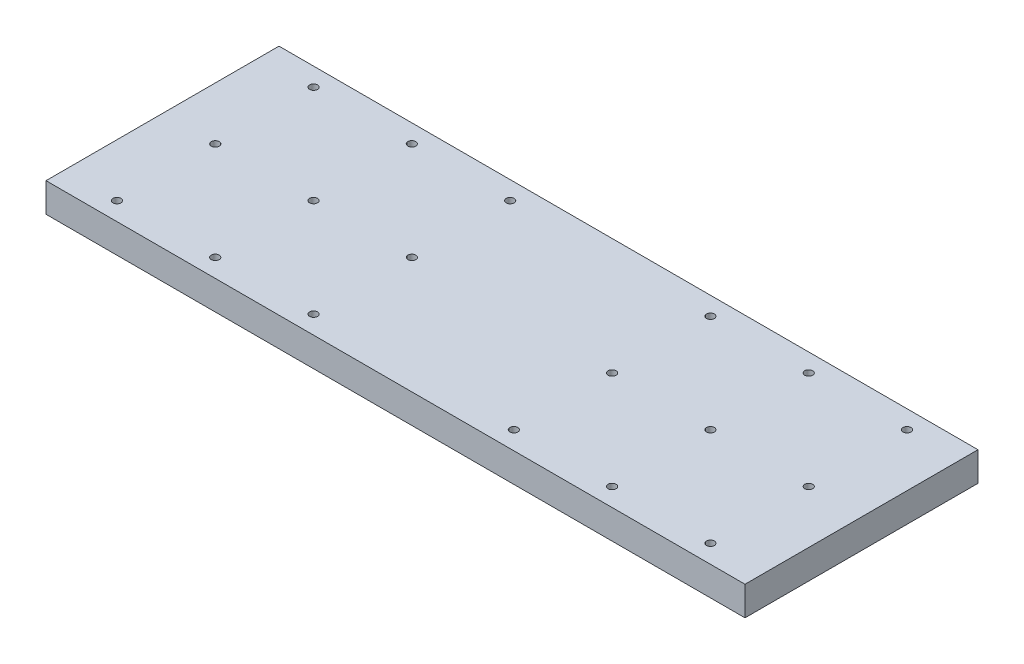
ISO-10303-21;
HEADER;
FILE_DESCRIPTION(('STEP AP214'),'2;1');
FILE_NAME('part.step','',(''),(''),'','','');
FILE_SCHEMA(('AUTOMOTIVE_DESIGN { 1 0 10303 214 1 1 1 1 }'));
ENDSEC;
DATA;
#1=APPLICATION_CONTEXT('core data for automotive mechanical design processes');
#2=APPLICATION_PROTOCOL_DEFINITION('international standard','automotive_design',2000,#1);
#3=PRODUCT_CONTEXT('',#1,'mechanical');
#4=PRODUCT('Part','Part','',(#3));
#5=PRODUCT_RELATED_PRODUCT_CATEGORY('part','',(#4));
#6=PRODUCT_DEFINITION_FORMATION('','',#4);
#7=PRODUCT_DEFINITION_CONTEXT('part definition',#1,'design');
#8=PRODUCT_DEFINITION('design','',#6,#7);
#9=PRODUCT_DEFINITION_SHAPE('','',#8);
#10=(LENGTH_UNIT() NAMED_UNIT(*) SI_UNIT(.MILLI.,.METRE.));
#11=(NAMED_UNIT(*) PLANE_ANGLE_UNIT() SI_UNIT($,.RADIAN.));
#12=(NAMED_UNIT(*) SI_UNIT($,.STERADIAN.) SOLID_ANGLE_UNIT());
#13=UNCERTAINTY_MEASURE_WITH_UNIT(LENGTH_MEASURE(1.E-05),#10,'distance_accuracy_value','');
#14=(GEOMETRIC_REPRESENTATION_CONTEXT(3) GLOBAL_UNCERTAINTY_ASSIGNED_CONTEXT((#13)) GLOBAL_UNIT_ASSIGNED_CONTEXT((#10,
#11,#12)) REPRESENTATION_CONTEXT('',''));
#15=CARTESIAN_POINT('',(0.,0.,0.));
#16=DIRECTION('',(0.,0.,1.));
#17=DIRECTION('',(1.,0.,0.));
#18=AXIS2_PLACEMENT_3D('',#15,#16,#17);
#19=CARTESIAN_POINT('',(0.,12.7,0.));
#20=DIRECTION('',(1.,0.,0.));
#21=DIRECTION('',(0.,0.,-1.));
#22=AXIS2_PLACEMENT_3D('',#19,#20,#21);
#23=PLANE('',#22);
#24=DIRECTION('',(0.,0.,1.));
#25=VECTOR('',#24,1.);
#26=CARTESIAN_POINT('',(0.,0.,0.));
#27=LINE('',#26,#25);
#28=CARTESIAN_POINT('',(0.,0.,-101.6));
#29=VERTEX_POINT('',#28);
#30=CARTESIAN_POINT('',(0.,0.,0.));
#31=VERTEX_POINT('',#30);
#32=EDGE_CURVE('E98',#29,#31,#27,.T.);
#33=ORIENTED_EDGE('',*,*,#32,.T.);
#34=DIRECTION('',(0.,-1.,0.));
#35=VECTOR('',#34,1.);
#36=CARTESIAN_POINT('',(0.,12.7,0.));
#37=LINE('',#36,#35);
#38=CARTESIAN_POINT('',(0.,12.7,0.));
#39=VERTEX_POINT('',#38);
#40=EDGE_CURVE('E11',#39,#31,#37,.T.);
#41=ORIENTED_EDGE('',*,*,#40,.F.);
#42=DIRECTION('',(0.,0.,1.));
#43=VECTOR('',#42,1.);
#44=CARTESIAN_POINT('',(0.,12.7,0.));
#45=LINE('',#44,#43);
#46=CARTESIAN_POINT('',(0.,12.7,-101.6));
#47=VERTEX_POINT('',#46);
#48=EDGE_CURVE('E86',#47,#39,#45,.T.);
#49=ORIENTED_EDGE('',*,*,#48,.F.);
#50=DIRECTION('',(0.,-1.,0.));
#51=VECTOR('',#50,1.);
#52=CARTESIAN_POINT('',(0.,12.7,-101.6));
#53=LINE('',#52,#51);
#54=EDGE_CURVE('E94',#47,#29,#53,.T.);
#55=ORIENTED_EDGE('',*,*,#54,.T.);
#56=EDGE_LOOP('',(#33,#41,#49,#55));
#57=FACE_BOUND('',#56,.T.);
#58=ADVANCED_FACE('F35',(#57),#23,.F.);
#59=CARTESIAN_POINT('',(0.,12.7,0.));
#60=DIRECTION('',(0.,0.,-1.));
#61=DIRECTION('',(-1.,0.,0.));
#62=AXIS2_PLACEMENT_3D('',#59,#60,#61);
#63=PLANE('',#62);
#64=DIRECTION('',(1.,0.,0.));
#65=VECTOR('',#64,1.);
#66=CARTESIAN_POINT('',(0.,0.,0.));
#67=LINE('',#66,#65);
#68=CARTESIAN_POINT('',(304.8,0.,0.));
#69=VERTEX_POINT('',#68);
#70=EDGE_CURVE('E90',#31,#69,#67,.T.);
#71=ORIENTED_EDGE('',*,*,#70,.T.);
#72=DIRECTION('',(0.,-1.,0.));
#73=VECTOR('',#72,1.);
#74=CARTESIAN_POINT('',(304.8,12.7,0.));
#75=LINE('',#74,#73);
#76=CARTESIAN_POINT('',(304.8,12.7,0.));
#77=VERTEX_POINT('',#76);
#78=EDGE_CURVE('E43',#77,#69,#75,.T.);
#79=ORIENTED_EDGE('',*,*,#78,.F.);
#80=DIRECTION('',(1.,0.,0.));
#81=VECTOR('',#80,1.);
#82=CARTESIAN_POINT('',(0.,12.7,0.));
#83=LINE('',#82,#81);
#84=EDGE_CURVE('E81',#39,#77,#83,.T.);
#85=ORIENTED_EDGE('',*,*,#84,.F.);
#86=ORIENTED_EDGE('',*,*,#40,.T.);
#87=EDGE_LOOP('',(#71,#79,#85,#86));
#88=FACE_BOUND('',#87,.T.);
#89=ADVANCED_FACE('F89',(#88),#63,.F.);
#90=CARTESIAN_POINT('',(304.8,12.7,0.));
#91=DIRECTION('',(-1.,0.,0.));
#92=DIRECTION('',(0.,0.,1.));
#93=AXIS2_PLACEMENT_3D('',#90,#91,#92);
#94=PLANE('',#93);
#95=DIRECTION('',(0.,0.,-1.));
#96=VECTOR('',#95,1.);
#97=CARTESIAN_POINT('',(304.8,0.,0.));
#98=LINE('',#97,#96);
#99=CARTESIAN_POINT('',(304.8,0.,-101.6));
#100=VERTEX_POINT('',#99);
#101=EDGE_CURVE('E68',#69,#100,#98,.T.);
#102=ORIENTED_EDGE('',*,*,#101,.T.);
#103=DIRECTION('',(0.,-1.,0.));
#104=VECTOR('',#103,1.);
#105=CARTESIAN_POINT('',(304.8,12.7,-101.6));
#106=LINE('',#105,#104);
#107=CARTESIAN_POINT('',(304.8,12.7,-101.6));
#108=VERTEX_POINT('',#107);
#109=EDGE_CURVE('E91',#108,#100,#106,.T.);
#110=ORIENTED_EDGE('',*,*,#109,.F.);
#111=DIRECTION('',(0.,0.,-1.));
#112=VECTOR('',#111,1.);
#113=CARTESIAN_POINT('',(304.8,12.7,0.));
#114=LINE('',#113,#112);
#115=EDGE_CURVE('E84',#77,#108,#114,.T.);
#116=ORIENTED_EDGE('',*,*,#115,.F.);
#117=ORIENTED_EDGE('',*,*,#78,.T.);
#118=EDGE_LOOP('',(#102,#110,#116,#117));
#119=FACE_BOUND('',#118,.T.);
#120=ADVANCED_FACE('F92',(#119),#94,.F.);
#121=CARTESIAN_POINT('',(0.,12.7,-101.6));
#122=DIRECTION('',(0.,0.,1.));
#123=DIRECTION('',(1.,0.,0.));
#124=AXIS2_PLACEMENT_3D('',#121,#122,#123);
#125=PLANE('',#124);
#126=DIRECTION('',(-1.,0.,0.));
#127=VECTOR('',#126,1.);
#128=CARTESIAN_POINT('',(0.,0.,-101.6));
#129=LINE('',#128,#127);
#130=EDGE_CURVE('E74',#100,#29,#129,.T.);
#131=ORIENTED_EDGE('',*,*,#130,.T.);
#132=ORIENTED_EDGE('',*,*,#54,.F.);
#133=DIRECTION('',(-1.,0.,0.));
#134=VECTOR('',#133,1.);
#135=CARTESIAN_POINT('',(0.,12.7,-101.6));
#136=LINE('',#135,#134);
#137=EDGE_CURVE('E51',#108,#47,#136,.T.);
#138=ORIENTED_EDGE('',*,*,#137,.F.);
#139=ORIENTED_EDGE('',*,*,#109,.T.);
#140=EDGE_LOOP('',(#131,#132,#138,#139));
#141=FACE_BOUND('',#140,.T.);
#142=ADVANCED_FACE('F106',(#141),#125,.F.);
#143=CARTESIAN_POINT('',(0.,12.7,0.));
#144=DIRECTION('',(0.,-1.,0.));
#145=DIRECTION('',(0.,0.,-1.));
#146=AXIS2_PLACEMENT_3D('',#143,#144,#145);
#147=PLANE('',#146);
#148=CARTESIAN_POINT('',(23.01875,12.7,-93.6625));
#149=DIRECTION('',(0.,1.,0.));
#150=DIRECTION('',(0.,0.,1.));
#151=AXIS2_PLACEMENT_3D('',#148,#149,#150);
#152=CIRCLE('',#151,1.72719999999999);
#153=CARTESIAN_POINT('',(23.01875,12.7,-91.9353));
#154=VERTEX_POINT('',#153);
#155=EDGE_CURVE('E216',#154,#154,#152,.T.);
#156=ORIENTED_EDGE('',*,*,#155,.F.);
#157=EDGE_LOOP('',(#156));
#158=FACE_BOUND('',#157,.T.);
#159=CARTESIAN_POINT('',(65.8571604822856,12.7,-93.6625));
#160=DIRECTION('',(0.,1.,0.));
#161=DIRECTION('',(0.,0.,1.));
#162=AXIS2_PLACEMENT_3D('',#159,#160,#161);
#163=CIRCLE('',#162,1.72719999999998);
#164=CARTESIAN_POINT('',(65.8571604822856,12.7,-91.9353));
#165=VERTEX_POINT('',#164);
#166=EDGE_CURVE('E210',#165,#165,#163,.T.);
#167=ORIENTED_EDGE('',*,*,#166,.F.);
#168=EDGE_LOOP('',(#167));
#169=FACE_BOUND('',#168,.T.);
#170=CARTESIAN_POINT('',(108.74375,12.7,-93.6625));
#171=DIRECTION('',(0.,1.,0.));
#172=DIRECTION('',(0.,0.,1.));
#173=AXIS2_PLACEMENT_3D('',#170,#171,#172);
#174=CIRCLE('',#173,1.72719999999998);
#175=CARTESIAN_POINT('',(108.74375,12.7,-91.9353));
#176=VERTEX_POINT('',#175);
#177=EDGE_CURVE('E204',#176,#176,#174,.T.);
#178=ORIENTED_EDGE('',*,*,#177,.F.);
#179=EDGE_LOOP('',(#178));
#180=FACE_BOUND('',#179,.T.);
#181=CARTESIAN_POINT('',(196.05625,12.7,-93.6625));
#182=DIRECTION('',(0.,1.,0.));
#183=DIRECTION('',(0.,0.,1.));
#184=AXIS2_PLACEMENT_3D('',#181,#182,#183);
#185=CIRCLE('',#184,1.72719999999998);
#186=CARTESIAN_POINT('',(196.05625,12.7,-91.9353));
#187=VERTEX_POINT('',#186);
#188=EDGE_CURVE('E198',#187,#187,#185,.T.);
#189=ORIENTED_EDGE('',*,*,#188,.F.);
#190=EDGE_LOOP('',(#189));
#191=FACE_BOUND('',#190,.T.);
#192=CARTESIAN_POINT('',(238.91875,12.7,-93.6625));
#193=DIRECTION('',(0.,1.,0.));
#194=DIRECTION('',(0.,0.,1.));
#195=AXIS2_PLACEMENT_3D('',#192,#193,#194);
#196=CIRCLE('',#195,1.72719999999998);
#197=CARTESIAN_POINT('',(238.91875,12.7,-91.9353));
#198=VERTEX_POINT('',#197);
#199=EDGE_CURVE('E192',#198,#198,#196,.T.);
#200=ORIENTED_EDGE('',*,*,#199,.F.);
#201=EDGE_LOOP('',(#200));
#202=FACE_BOUND('',#201,.T.);
#203=CARTESIAN_POINT('',(281.78125,12.7,-93.6625));
#204=DIRECTION('',(0.,1.,0.));
#205=DIRECTION('',(0.,0.,1.));
#206=AXIS2_PLACEMENT_3D('',#203,#204,#205);
#207=CIRCLE('',#206,1.72719999999998);
#208=CARTESIAN_POINT('',(281.78125,12.7,-91.9353));
#209=VERTEX_POINT('',#208);
#210=EDGE_CURVE('E186',#209,#209,#207,.T.);
#211=ORIENTED_EDGE('',*,*,#210,.F.);
#212=EDGE_LOOP('',(#211));
#213=FACE_BOUND('',#212,.T.);
#214=CARTESIAN_POINT('',(23.01875,12.7,-50.8));
#215=DIRECTION('',(0.,1.,0.));
#216=DIRECTION('',(0.,0.,1.));
#217=AXIS2_PLACEMENT_3D('',#214,#215,#216);
#218=CIRCLE('',#217,1.72719999999999);
#219=CARTESIAN_POINT('',(23.01875,12.7,-49.0728));
#220=VERTEX_POINT('',#219);
#221=EDGE_CURVE('E180',#220,#220,#218,.T.);
#222=ORIENTED_EDGE('',*,*,#221,.F.);
#223=EDGE_LOOP('',(#222));
#224=FACE_BOUND('',#223,.T.);
#225=CARTESIAN_POINT('',(65.8571604822857,12.7,-50.8));
#226=DIRECTION('',(0.,1.,0.));
#227=DIRECTION('',(0.,0.,1.));
#228=AXIS2_PLACEMENT_3D('',#225,#226,#227);
#229=CIRCLE('',#228,1.72719999999998);
#230=CARTESIAN_POINT('',(65.8571604822857,12.7,-49.0728));
#231=VERTEX_POINT('',#230);
#232=EDGE_CURVE('E174',#231,#231,#229,.T.);
#233=ORIENTED_EDGE('',*,*,#232,.F.);
#234=EDGE_LOOP('',(#233));
#235=FACE_BOUND('',#234,.T.);
#236=CARTESIAN_POINT('',(108.74375,12.7,-50.8));
#237=DIRECTION('',(0.,1.,0.));
#238=DIRECTION('',(0.,0.,1.));
#239=AXIS2_PLACEMENT_3D('',#236,#237,#238);
#240=CIRCLE('',#239,1.72719999999998);
#241=CARTESIAN_POINT('',(108.74375,12.7,-49.0728));
#242=VERTEX_POINT('',#241);
#243=EDGE_CURVE('E168',#242,#242,#240,.T.);
#244=ORIENTED_EDGE('',*,*,#243,.F.);
#245=EDGE_LOOP('',(#244));
#246=FACE_BOUND('',#245,.T.);
#247=CARTESIAN_POINT('',(196.05625,12.7,-50.8));
#248=DIRECTION('',(0.,1.,0.));
#249=DIRECTION('',(0.,0.,1.));
#250=AXIS2_PLACEMENT_3D('',#247,#248,#249);
#251=CIRCLE('',#250,1.72719999999998);
#252=CARTESIAN_POINT('',(196.05625,12.7,-49.0728));
#253=VERTEX_POINT('',#252);
#254=EDGE_CURVE('E162',#253,#253,#251,.T.);
#255=ORIENTED_EDGE('',*,*,#254,.F.);
#256=EDGE_LOOP('',(#255));
#257=FACE_BOUND('',#256,.T.);
#258=CARTESIAN_POINT('',(238.91875,12.7,-50.8));
#259=DIRECTION('',(0.,1.,0.));
#260=DIRECTION('',(0.,0.,1.));
#261=AXIS2_PLACEMENT_3D('',#258,#259,#260);
#262=CIRCLE('',#261,1.72719999999998);
#263=CARTESIAN_POINT('',(238.91875,12.7,-49.0728));
#264=VERTEX_POINT('',#263);
#265=EDGE_CURVE('E156',#264,#264,#262,.T.);
#266=ORIENTED_EDGE('',*,*,#265,.F.);
#267=EDGE_LOOP('',(#266));
#268=FACE_BOUND('',#267,.T.);
#269=CARTESIAN_POINT('',(281.78125,12.7,-50.8));
#270=DIRECTION('',(0.,1.,0.));
#271=DIRECTION('',(0.,0.,1.));
#272=AXIS2_PLACEMENT_3D('',#269,#270,#271);
#273=CIRCLE('',#272,1.72719999999998);
#274=CARTESIAN_POINT('',(281.78125,12.7,-49.0728));
#275=VERTEX_POINT('',#274);
#276=EDGE_CURVE('E150',#275,#275,#273,.T.);
#277=ORIENTED_EDGE('',*,*,#276,.F.);
#278=EDGE_LOOP('',(#277));
#279=FACE_BOUND('',#278,.T.);
#280=CARTESIAN_POINT('',(23.01875,12.7,-7.9375));
#281=DIRECTION('',(0.,1.,0.));
#282=DIRECTION('',(0.,0.,1.));
#283=AXIS2_PLACEMENT_3D('',#280,#281,#282);
#284=CIRCLE('',#283,1.72719999999999);
#285=CARTESIAN_POINT('',(23.01875,12.7,-6.21030000000001));
#286=VERTEX_POINT('',#285);
#287=EDGE_CURVE('E144',#286,#286,#284,.T.);
#288=ORIENTED_EDGE('',*,*,#287,.F.);
#289=EDGE_LOOP('',(#288));
#290=FACE_BOUND('',#289,.T.);
#291=CARTESIAN_POINT('',(65.8571604822857,12.7,-7.9375));
#292=DIRECTION('',(0.,1.,0.));
#293=DIRECTION('',(0.,0.,1.));
#294=AXIS2_PLACEMENT_3D('',#291,#292,#293);
#295=CIRCLE('',#294,1.72719999999998);
#296=CARTESIAN_POINT('',(65.8571604822857,12.7,-6.21030000000002));
#297=VERTEX_POINT('',#296);
#298=EDGE_CURVE('E138',#297,#297,#295,.T.);
#299=ORIENTED_EDGE('',*,*,#298,.F.);
#300=EDGE_LOOP('',(#299));
#301=FACE_BOUND('',#300,.T.);
#302=CARTESIAN_POINT('',(108.74375,12.7,-7.9375));
#303=DIRECTION('',(0.,1.,0.));
#304=DIRECTION('',(0.,0.,1.));
#305=AXIS2_PLACEMENT_3D('',#302,#303,#304);
#306=CIRCLE('',#305,1.72719999999998);
#307=CARTESIAN_POINT('',(108.74375,12.7,-6.21030000000002));
#308=VERTEX_POINT('',#307);
#309=EDGE_CURVE('E132',#308,#308,#306,.T.);
#310=ORIENTED_EDGE('',*,*,#309,.F.);
#311=EDGE_LOOP('',(#310));
#312=FACE_BOUND('',#311,.T.);
#313=CARTESIAN_POINT('',(196.05625,12.7,-7.9375));
#314=DIRECTION('',(0.,1.,0.));
#315=DIRECTION('',(0.,0.,1.));
#316=AXIS2_PLACEMENT_3D('',#313,#314,#315);
#317=CIRCLE('',#316,1.72719999999998);
#318=CARTESIAN_POINT('',(196.05625,12.7,-6.21030000000002));
#319=VERTEX_POINT('',#318);
#320=EDGE_CURVE('E126',#319,#319,#317,.T.);
#321=ORIENTED_EDGE('',*,*,#320,.F.);
#322=EDGE_LOOP('',(#321));
#323=FACE_BOUND('',#322,.T.);
#324=CARTESIAN_POINT('',(238.91875,12.7,-7.9375));
#325=DIRECTION('',(0.,1.,0.));
#326=DIRECTION('',(0.,0.,1.));
#327=AXIS2_PLACEMENT_3D('',#324,#325,#326);
#328=CIRCLE('',#327,1.72719999999998);
#329=CARTESIAN_POINT('',(238.91875,12.7,-6.21030000000002));
#330=VERTEX_POINT('',#329);
#331=EDGE_CURVE('E120',#330,#330,#328,.T.);
#332=ORIENTED_EDGE('',*,*,#331,.F.);
#333=EDGE_LOOP('',(#332));
#334=FACE_BOUND('',#333,.T.);
#335=CARTESIAN_POINT('',(281.78125,12.7,-7.9375));
#336=DIRECTION('',(0.,1.,0.));
#337=DIRECTION('',(0.,0.,1.));
#338=AXIS2_PLACEMENT_3D('',#335,#336,#337);
#339=CIRCLE('',#338,1.72719999999998);
#340=CARTESIAN_POINT('',(281.78125,12.7,-6.21030000000002));
#341=VERTEX_POINT('',#340);
#342=EDGE_CURVE('E114',#341,#341,#339,.T.);
#343=ORIENTED_EDGE('',*,*,#342,.F.);
#344=EDGE_LOOP('',(#343));
#345=FACE_BOUND('',#344,.T.);
#346=ORIENTED_EDGE('',*,*,#48,.T.);
#347=ORIENTED_EDGE('',*,*,#84,.T.);
#348=ORIENTED_EDGE('',*,*,#115,.T.);
#349=ORIENTED_EDGE('',*,*,#137,.T.);
#350=EDGE_LOOP('',(#346,#347,#348,#349));
#351=FACE_BOUND('',#350,.T.);
#352=ADVANCED_FACE('F82',(#158,#169,#180,#191,#202,#213,#224,#235,#246,#257,#268,#279,#290,#301,
#312,#323,#334,#345,#351),#147,.F.);
#353=CARTESIAN_POINT('',(0.,0.,0.));
#354=DIRECTION('',(0.,-1.,0.));
#355=DIRECTION('',(0.,0.,-1.));
#356=AXIS2_PLACEMENT_3D('',#353,#354,#355);
#357=PLANE('',#356);
#358=CARTESIAN_POINT('',(23.01875,0.,-93.6625));
#359=DIRECTION('',(0.,1.,0.));
#360=DIRECTION('',(0.,0.,1.));
#361=AXIS2_PLACEMENT_3D('',#358,#359,#360);
#362=CIRCLE('',#361,1.7272);
#363=CARTESIAN_POINT('',(23.01875,0.,-91.9353));
#364=VERTEX_POINT('',#363);
#365=EDGE_CURVE('E213',#364,#364,#362,.T.);
#366=ORIENTED_EDGE('',*,*,#365,.T.);
#367=EDGE_LOOP('',(#366));
#368=FACE_BOUND('',#367,.T.);
#369=CARTESIAN_POINT('',(65.8571604822856,0.,-93.6625));
#370=DIRECTION('',(0.,1.,0.));
#371=DIRECTION('',(0.,0.,1.));
#372=AXIS2_PLACEMENT_3D('',#369,#370,#371);
#373=CIRCLE('',#372,1.7272);
#374=CARTESIAN_POINT('',(65.8571604822856,0.,-91.9353));
#375=VERTEX_POINT('',#374);
#376=EDGE_CURVE('E207',#375,#375,#373,.T.);
#377=ORIENTED_EDGE('',*,*,#376,.T.);
#378=EDGE_LOOP('',(#377));
#379=FACE_BOUND('',#378,.T.);
#380=CARTESIAN_POINT('',(108.74375,0.,-93.6625));
#381=DIRECTION('',(0.,1.,0.));
#382=DIRECTION('',(0.,0.,1.));
#383=AXIS2_PLACEMENT_3D('',#380,#381,#382);
#384=CIRCLE('',#383,1.7272);
#385=CARTESIAN_POINT('',(108.74375,0.,-91.9353));
#386=VERTEX_POINT('',#385);
#387=EDGE_CURVE('E201',#386,#386,#384,.T.);
#388=ORIENTED_EDGE('',*,*,#387,.T.);
#389=EDGE_LOOP('',(#388));
#390=FACE_BOUND('',#389,.T.);
#391=CARTESIAN_POINT('',(196.05625,0.,-93.6625));
#392=DIRECTION('',(0.,1.,0.));
#393=DIRECTION('',(0.,0.,1.));
#394=AXIS2_PLACEMENT_3D('',#391,#392,#393);
#395=CIRCLE('',#394,1.72719999999998);
#396=CARTESIAN_POINT('',(196.05625,0.,-91.9353));
#397=VERTEX_POINT('',#396);
#398=EDGE_CURVE('E195',#397,#397,#395,.T.);
#399=ORIENTED_EDGE('',*,*,#398,.T.);
#400=EDGE_LOOP('',(#399));
#401=FACE_BOUND('',#400,.T.);
#402=CARTESIAN_POINT('',(238.91875,0.,-93.6625));
#403=DIRECTION('',(0.,1.,0.));
#404=DIRECTION('',(0.,0.,1.));
#405=AXIS2_PLACEMENT_3D('',#402,#403,#404);
#406=CIRCLE('',#405,1.72719999999998);
#407=CARTESIAN_POINT('',(238.91875,0.,-91.9353));
#408=VERTEX_POINT('',#407);
#409=EDGE_CURVE('E189',#408,#408,#406,.T.);
#410=ORIENTED_EDGE('',*,*,#409,.T.);
#411=EDGE_LOOP('',(#410));
#412=FACE_BOUND('',#411,.T.);
#413=CARTESIAN_POINT('',(281.78125,0.,-93.6625));
#414=DIRECTION('',(0.,1.,0.));
#415=DIRECTION('',(0.,0.,1.));
#416=AXIS2_PLACEMENT_3D('',#413,#414,#415);
#417=CIRCLE('',#416,1.72719999999998);
#418=CARTESIAN_POINT('',(281.78125,0.,-91.9353));
#419=VERTEX_POINT('',#418);
#420=EDGE_CURVE('E183',#419,#419,#417,.T.);
#421=ORIENTED_EDGE('',*,*,#420,.T.);
#422=EDGE_LOOP('',(#421));
#423=FACE_BOUND('',#422,.T.);
#424=CARTESIAN_POINT('',(23.01875,0.,-50.8));
#425=DIRECTION('',(0.,1.,0.));
#426=DIRECTION('',(0.,0.,1.));
#427=AXIS2_PLACEMENT_3D('',#424,#425,#426);
#428=CIRCLE('',#427,1.7272);
#429=CARTESIAN_POINT('',(23.01875,0.,-49.0728));
#430=VERTEX_POINT('',#429);
#431=EDGE_CURVE('E177',#430,#430,#428,.T.);
#432=ORIENTED_EDGE('',*,*,#431,.T.);
#433=EDGE_LOOP('',(#432));
#434=FACE_BOUND('',#433,.T.);
#435=CARTESIAN_POINT('',(65.8571604822857,0.,-50.8));
#436=DIRECTION('',(0.,1.,0.));
#437=DIRECTION('',(0.,0.,1.));
#438=AXIS2_PLACEMENT_3D('',#435,#436,#437);
#439=CIRCLE('',#438,1.7272);
#440=CARTESIAN_POINT('',(65.8571604822857,0.,-49.0728));
#441=VERTEX_POINT('',#440);
#442=EDGE_CURVE('E171',#441,#441,#439,.T.);
#443=ORIENTED_EDGE('',*,*,#442,.T.);
#444=EDGE_LOOP('',(#443));
#445=FACE_BOUND('',#444,.T.);
#446=CARTESIAN_POINT('',(108.74375,0.,-50.8));
#447=DIRECTION('',(0.,1.,0.));
#448=DIRECTION('',(0.,0.,1.));
#449=AXIS2_PLACEMENT_3D('',#446,#447,#448);
#450=CIRCLE('',#449,1.7272);
#451=CARTESIAN_POINT('',(108.74375,0.,-49.0728));
#452=VERTEX_POINT('',#451);
#453=EDGE_CURVE('E165',#452,#452,#450,.T.);
#454=ORIENTED_EDGE('',*,*,#453,.T.);
#455=EDGE_LOOP('',(#454));
#456=FACE_BOUND('',#455,.T.);
#457=CARTESIAN_POINT('',(196.05625,0.,-50.8));
#458=DIRECTION('',(0.,1.,0.));
#459=DIRECTION('',(0.,0.,1.));
#460=AXIS2_PLACEMENT_3D('',#457,#458,#459);
#461=CIRCLE('',#460,1.72719999999998);
#462=CARTESIAN_POINT('',(196.05625,0.,-49.0728));
#463=VERTEX_POINT('',#462);
#464=EDGE_CURVE('E159',#463,#463,#461,.T.);
#465=ORIENTED_EDGE('',*,*,#464,.T.);
#466=EDGE_LOOP('',(#465));
#467=FACE_BOUND('',#466,.T.);
#468=CARTESIAN_POINT('',(238.91875,0.,-50.8));
#469=DIRECTION('',(0.,1.,0.));
#470=DIRECTION('',(0.,0.,1.));
#471=AXIS2_PLACEMENT_3D('',#468,#469,#470);
#472=CIRCLE('',#471,1.72719999999998);
#473=CARTESIAN_POINT('',(238.91875,0.,-49.0728));
#474=VERTEX_POINT('',#473);
#475=EDGE_CURVE('E153',#474,#474,#472,.T.);
#476=ORIENTED_EDGE('',*,*,#475,.T.);
#477=EDGE_LOOP('',(#476));
#478=FACE_BOUND('',#477,.T.);
#479=CARTESIAN_POINT('',(281.78125,0.,-50.8));
#480=DIRECTION('',(0.,1.,0.));
#481=DIRECTION('',(0.,0.,1.));
#482=AXIS2_PLACEMENT_3D('',#479,#480,#481);
#483=CIRCLE('',#482,1.72719999999998);
#484=CARTESIAN_POINT('',(281.78125,0.,-49.0728));
#485=VERTEX_POINT('',#484);
#486=EDGE_CURVE('E147',#485,#485,#483,.T.);
#487=ORIENTED_EDGE('',*,*,#486,.T.);
#488=EDGE_LOOP('',(#487));
#489=FACE_BOUND('',#488,.T.);
#490=CARTESIAN_POINT('',(23.01875,0.,-7.9375));
#491=DIRECTION('',(0.,1.,0.));
#492=DIRECTION('',(0.,0.,1.));
#493=AXIS2_PLACEMENT_3D('',#490,#491,#492);
#494=CIRCLE('',#493,1.7272);
#495=CARTESIAN_POINT('',(23.01875,0.,-6.2103));
#496=VERTEX_POINT('',#495);
#497=EDGE_CURVE('E141',#496,#496,#494,.T.);
#498=ORIENTED_EDGE('',*,*,#497,.T.);
#499=EDGE_LOOP('',(#498));
#500=FACE_BOUND('',#499,.T.);
#501=CARTESIAN_POINT('',(65.8571604822857,0.,-7.9375));
#502=DIRECTION('',(0.,1.,0.));
#503=DIRECTION('',(0.,0.,1.));
#504=AXIS2_PLACEMENT_3D('',#501,#502,#503);
#505=CIRCLE('',#504,1.7272);
#506=CARTESIAN_POINT('',(65.8571604822857,0.,-6.2103));
#507=VERTEX_POINT('',#506);
#508=EDGE_CURVE('E135',#507,#507,#505,.T.);
#509=ORIENTED_EDGE('',*,*,#508,.T.);
#510=EDGE_LOOP('',(#509));
#511=FACE_BOUND('',#510,.T.);
#512=CARTESIAN_POINT('',(108.74375,0.,-7.9375));
#513=DIRECTION('',(0.,1.,0.));
#514=DIRECTION('',(0.,0.,1.));
#515=AXIS2_PLACEMENT_3D('',#512,#513,#514);
#516=CIRCLE('',#515,1.7272);
#517=CARTESIAN_POINT('',(108.74375,0.,-6.2103));
#518=VERTEX_POINT('',#517);
#519=EDGE_CURVE('E129',#518,#518,#516,.T.);
#520=ORIENTED_EDGE('',*,*,#519,.T.);
#521=EDGE_LOOP('',(#520));
#522=FACE_BOUND('',#521,.T.);
#523=CARTESIAN_POINT('',(196.05625,0.,-7.9375));
#524=DIRECTION('',(0.,1.,0.));
#525=DIRECTION('',(0.,0.,1.));
#526=AXIS2_PLACEMENT_3D('',#523,#524,#525);
#527=CIRCLE('',#526,1.72719999999998);
#528=CARTESIAN_POINT('',(196.05625,0.,-6.21030000000002));
#529=VERTEX_POINT('',#528);
#530=EDGE_CURVE('E123',#529,#529,#527,.T.);
#531=ORIENTED_EDGE('',*,*,#530,.T.);
#532=EDGE_LOOP('',(#531));
#533=FACE_BOUND('',#532,.T.);
#534=CARTESIAN_POINT('',(238.91875,0.,-7.9375));
#535=DIRECTION('',(0.,1.,0.));
#536=DIRECTION('',(0.,0.,1.));
#537=AXIS2_PLACEMENT_3D('',#534,#535,#536);
#538=CIRCLE('',#537,1.72719999999998);
#539=CARTESIAN_POINT('',(238.91875,0.,-6.21030000000002));
#540=VERTEX_POINT('',#539);
#541=EDGE_CURVE('E117',#540,#540,#538,.T.);
#542=ORIENTED_EDGE('',*,*,#541,.T.);
#543=EDGE_LOOP('',(#542));
#544=FACE_BOUND('',#543,.T.);
#545=CARTESIAN_POINT('',(281.78125,0.,-7.9375));
#546=DIRECTION('',(0.,1.,0.));
#547=DIRECTION('',(0.,0.,1.));
#548=AXIS2_PLACEMENT_3D('',#545,#546,#547);
#549=CIRCLE('',#548,1.72719999999998);
#550=CARTESIAN_POINT('',(281.78125,0.,-6.21030000000002));
#551=VERTEX_POINT('',#550);
#552=EDGE_CURVE('E101',#551,#551,#549,.T.);
#553=ORIENTED_EDGE('',*,*,#552,.T.);
#554=EDGE_LOOP('',(#553));
#555=FACE_BOUND('',#554,.T.);
#556=ORIENTED_EDGE('',*,*,#32,.F.);
#557=ORIENTED_EDGE('',*,*,#130,.F.);
#558=ORIENTED_EDGE('',*,*,#101,.F.);
#559=ORIENTED_EDGE('',*,*,#70,.F.);
#560=EDGE_LOOP('',(#556,#557,#558,#559));
#561=FACE_BOUND('',#560,.T.);
#562=ADVANCED_FACE('F109',(#368,#379,#390,#401,#412,#423,#434,#445,#456,#467,#478,#489,#500,
#511,#522,#533,#544,#555,#561),#357,.T.);
#563=CARTESIAN_POINT('',(281.78125,12.7,-7.9375));
#564=DIRECTION('',(0.,1.,0.));
#565=DIRECTION('',(0.,0.,1.));
#566=AXIS2_PLACEMENT_3D('',#563,#564,#565);
#567=CYLINDRICAL_SURFACE('',#566,1.72719999999998);
#568=ORIENTED_EDGE('',*,*,#552,.F.);
#569=EDGE_LOOP('',(#568));
#570=FACE_BOUND('',#569,.T.);
#571=ORIENTED_EDGE('',*,*,#342,.T.);
#572=EDGE_LOOP('',(#571));
#573=FACE_BOUND('',#572,.T.);
#574=ADVANCED_FACE('F259',(#570,#573),#567,.F.);
#575=CARTESIAN_POINT('',(238.91875,12.7,-7.9375));
#576=DIRECTION('',(0.,1.,0.));
#577=DIRECTION('',(0.,0.,1.));
#578=AXIS2_PLACEMENT_3D('',#575,#576,#577);
#579=CYLINDRICAL_SURFACE('',#578,1.72719999999998);
#580=ORIENTED_EDGE('',*,*,#541,.F.);
#581=EDGE_LOOP('',(#580));
#582=FACE_BOUND('',#581,.T.);
#583=ORIENTED_EDGE('',*,*,#331,.T.);
#584=EDGE_LOOP('',(#583));
#585=FACE_BOUND('',#584,.T.);
#586=ADVANCED_FACE('F261',(#582,#585),#579,.F.);
#587=CARTESIAN_POINT('',(196.05625,12.7,-7.9375));
#588=DIRECTION('',(0.,1.,0.));
#589=DIRECTION('',(0.,0.,1.));
#590=AXIS2_PLACEMENT_3D('',#587,#588,#589);
#591=CYLINDRICAL_SURFACE('',#590,1.72719999999998);
#592=ORIENTED_EDGE('',*,*,#530,.F.);
#593=EDGE_LOOP('',(#592));
#594=FACE_BOUND('',#593,.T.);
#595=ORIENTED_EDGE('',*,*,#320,.T.);
#596=EDGE_LOOP('',(#595));
#597=FACE_BOUND('',#596,.T.);
#598=ADVANCED_FACE('F268',(#594,#597),#591,.F.);
#599=CARTESIAN_POINT('',(108.74375,12.7,-7.9375));
#600=DIRECTION('',(0.,1.,0.));
#601=DIRECTION('',(0.,0.,1.));
#602=AXIS2_PLACEMENT_3D('',#599,#600,#601);
#603=CYLINDRICAL_SURFACE('',#602,1.72719999999999);
#604=ORIENTED_EDGE('',*,*,#519,.F.);
#605=EDGE_LOOP('',(#604));
#606=FACE_BOUND('',#605,.T.);
#607=ORIENTED_EDGE('',*,*,#309,.T.);
#608=EDGE_LOOP('',(#607));
#609=FACE_BOUND('',#608,.T.);
#610=ADVANCED_FACE('F319',(#606,#609),#603,.F.);
#611=CARTESIAN_POINT('',(65.8571604822857,12.7,-7.9375));
#612=DIRECTION('',(0.,1.,0.));
#613=DIRECTION('',(0.,0.,1.));
#614=AXIS2_PLACEMENT_3D('',#611,#612,#613);
#615=CYLINDRICAL_SURFACE('',#614,1.72719999999999);
#616=ORIENTED_EDGE('',*,*,#508,.F.);
#617=EDGE_LOOP('',(#616));
#618=FACE_BOUND('',#617,.T.);
#619=ORIENTED_EDGE('',*,*,#298,.T.);
#620=EDGE_LOOP('',(#619));
#621=FACE_BOUND('',#620,.T.);
#622=ADVANCED_FACE('F330',(#618,#621),#615,.F.);
#623=CARTESIAN_POINT('',(23.01875,12.7,-7.9375));
#624=DIRECTION('',(0.,1.,0.));
#625=DIRECTION('',(0.,0.,1.));
#626=AXIS2_PLACEMENT_3D('',#623,#624,#625);
#627=CYLINDRICAL_SURFACE('',#626,1.72719999999999);
#628=ORIENTED_EDGE('',*,*,#497,.F.);
#629=EDGE_LOOP('',(#628));
#630=FACE_BOUND('',#629,.T.);
#631=ORIENTED_EDGE('',*,*,#287,.T.);
#632=EDGE_LOOP('',(#631));
#633=FACE_BOUND('',#632,.T.);
#634=ADVANCED_FACE('F341',(#630,#633),#627,.F.);
#635=CARTESIAN_POINT('',(281.78125,12.7,-50.8));
#636=DIRECTION('',(0.,1.,0.));
#637=DIRECTION('',(0.,0.,1.));
#638=AXIS2_PLACEMENT_3D('',#635,#636,#637);
#639=CYLINDRICAL_SURFACE('',#638,1.72719999999998);
#640=ORIENTED_EDGE('',*,*,#486,.F.);
#641=EDGE_LOOP('',(#640));
#642=FACE_BOUND('',#641,.T.);
#643=ORIENTED_EDGE('',*,*,#276,.T.);
#644=EDGE_LOOP('',(#643));
#645=FACE_BOUND('',#644,.T.);
#646=ADVANCED_FACE('F352',(#642,#645),#639,.F.);
#647=CARTESIAN_POINT('',(238.91875,12.7,-50.8));
#648=DIRECTION('',(0.,1.,0.));
#649=DIRECTION('',(0.,0.,1.));
#650=AXIS2_PLACEMENT_3D('',#647,#648,#649);
#651=CYLINDRICAL_SURFACE('',#650,1.72719999999998);
#652=ORIENTED_EDGE('',*,*,#475,.F.);
#653=EDGE_LOOP('',(#652));
#654=FACE_BOUND('',#653,.T.);
#655=ORIENTED_EDGE('',*,*,#265,.T.);
#656=EDGE_LOOP('',(#655));
#657=FACE_BOUND('',#656,.T.);
#658=ADVANCED_FACE('F363',(#654,#657),#651,.F.);
#659=CARTESIAN_POINT('',(196.05625,12.7,-50.8));
#660=DIRECTION('',(0.,1.,0.));
#661=DIRECTION('',(0.,0.,1.));
#662=AXIS2_PLACEMENT_3D('',#659,#660,#661);
#663=CYLINDRICAL_SURFACE('',#662,1.72719999999998);
#664=ORIENTED_EDGE('',*,*,#464,.F.);
#665=EDGE_LOOP('',(#664));
#666=FACE_BOUND('',#665,.T.);
#667=ORIENTED_EDGE('',*,*,#254,.T.);
#668=EDGE_LOOP('',(#667));
#669=FACE_BOUND('',#668,.T.);
#670=ADVANCED_FACE('F374',(#666,#669),#663,.F.);
#671=CARTESIAN_POINT('',(108.74375,12.7,-50.8));
#672=DIRECTION('',(0.,1.,0.));
#673=DIRECTION('',(0.,0.,1.));
#674=AXIS2_PLACEMENT_3D('',#671,#672,#673);
#675=CYLINDRICAL_SURFACE('',#674,1.72719999999999);
#676=ORIENTED_EDGE('',*,*,#453,.F.);
#677=EDGE_LOOP('',(#676));
#678=FACE_BOUND('',#677,.T.);
#679=ORIENTED_EDGE('',*,*,#243,.T.);
#680=EDGE_LOOP('',(#679));
#681=FACE_BOUND('',#680,.T.);
#682=ADVANCED_FACE('F385',(#678,#681),#675,.F.);
#683=CARTESIAN_POINT('',(65.8571604822857,12.7,-50.8));
#684=DIRECTION('',(0.,1.,0.));
#685=DIRECTION('',(0.,0.,1.));
#686=AXIS2_PLACEMENT_3D('',#683,#684,#685);
#687=CYLINDRICAL_SURFACE('',#686,1.72719999999999);
#688=ORIENTED_EDGE('',*,*,#442,.F.);
#689=EDGE_LOOP('',(#688));
#690=FACE_BOUND('',#689,.T.);
#691=ORIENTED_EDGE('',*,*,#232,.T.);
#692=EDGE_LOOP('',(#691));
#693=FACE_BOUND('',#692,.T.);
#694=ADVANCED_FACE('F396',(#690,#693),#687,.F.);
#695=CARTESIAN_POINT('',(23.01875,12.7,-50.8));
#696=DIRECTION('',(0.,1.,0.));
#697=DIRECTION('',(0.,0.,1.));
#698=AXIS2_PLACEMENT_3D('',#695,#696,#697);
#699=CYLINDRICAL_SURFACE('',#698,1.72719999999999);
#700=ORIENTED_EDGE('',*,*,#431,.F.);
#701=EDGE_LOOP('',(#700));
#702=FACE_BOUND('',#701,.T.);
#703=ORIENTED_EDGE('',*,*,#221,.T.);
#704=EDGE_LOOP('',(#703));
#705=FACE_BOUND('',#704,.T.);
#706=ADVANCED_FACE('F407',(#702,#705),#699,.F.);
#707=CARTESIAN_POINT('',(281.78125,12.7,-93.6625));
#708=DIRECTION('',(0.,1.,0.));
#709=DIRECTION('',(0.,0.,1.));
#710=AXIS2_PLACEMENT_3D('',#707,#708,#709);
#711=CYLINDRICAL_SURFACE('',#710,1.72719999999998);
#712=ORIENTED_EDGE('',*,*,#420,.F.);
#713=EDGE_LOOP('',(#712));
#714=FACE_BOUND('',#713,.T.);
#715=ORIENTED_EDGE('',*,*,#210,.T.);
#716=EDGE_LOOP('',(#715));
#717=FACE_BOUND('',#716,.T.);
#718=ADVANCED_FACE('F418',(#714,#717),#711,.F.);
#719=CARTESIAN_POINT('',(238.91875,12.7,-93.6625));
#720=DIRECTION('',(0.,1.,0.));
#721=DIRECTION('',(0.,0.,1.));
#722=AXIS2_PLACEMENT_3D('',#719,#720,#721);
#723=CYLINDRICAL_SURFACE('',#722,1.72719999999998);
#724=ORIENTED_EDGE('',*,*,#409,.F.);
#725=EDGE_LOOP('',(#724));
#726=FACE_BOUND('',#725,.T.);
#727=ORIENTED_EDGE('',*,*,#199,.T.);
#728=EDGE_LOOP('',(#727));
#729=FACE_BOUND('',#728,.T.);
#730=ADVANCED_FACE('F429',(#726,#729),#723,.F.);
#731=CARTESIAN_POINT('',(196.05625,12.7,-93.6625));
#732=DIRECTION('',(0.,1.,0.));
#733=DIRECTION('',(0.,0.,1.));
#734=AXIS2_PLACEMENT_3D('',#731,#732,#733);
#735=CYLINDRICAL_SURFACE('',#734,1.72719999999998);
#736=ORIENTED_EDGE('',*,*,#398,.F.);
#737=EDGE_LOOP('',(#736));
#738=FACE_BOUND('',#737,.T.);
#739=ORIENTED_EDGE('',*,*,#188,.T.);
#740=EDGE_LOOP('',(#739));
#741=FACE_BOUND('',#740,.T.);
#742=ADVANCED_FACE('F440',(#738,#741),#735,.F.);
#743=CARTESIAN_POINT('',(108.74375,12.7,-93.6625));
#744=DIRECTION('',(0.,1.,0.));
#745=DIRECTION('',(0.,0.,1.));
#746=AXIS2_PLACEMENT_3D('',#743,#744,#745);
#747=CYLINDRICAL_SURFACE('',#746,1.72719999999999);
#748=ORIENTED_EDGE('',*,*,#387,.F.);
#749=EDGE_LOOP('',(#748));
#750=FACE_BOUND('',#749,.T.);
#751=ORIENTED_EDGE('',*,*,#177,.T.);
#752=EDGE_LOOP('',(#751));
#753=FACE_BOUND('',#752,.T.);
#754=ADVANCED_FACE('F451',(#750,#753),#747,.F.);
#755=CARTESIAN_POINT('',(65.8571604822856,12.7,-93.6625));
#756=DIRECTION('',(0.,1.,0.));
#757=DIRECTION('',(0.,0.,1.));
#758=AXIS2_PLACEMENT_3D('',#755,#756,#757);
#759=CYLINDRICAL_SURFACE('',#758,1.72719999999999);
#760=ORIENTED_EDGE('',*,*,#376,.F.);
#761=EDGE_LOOP('',(#760));
#762=FACE_BOUND('',#761,.T.);
#763=ORIENTED_EDGE('',*,*,#166,.T.);
#764=EDGE_LOOP('',(#763));
#765=FACE_BOUND('',#764,.T.);
#766=ADVANCED_FACE('F462',(#762,#765),#759,.F.);
#767=CARTESIAN_POINT('',(23.01875,12.7,-93.6625));
#768=DIRECTION('',(0.,1.,0.));
#769=DIRECTION('',(0.,0.,1.));
#770=AXIS2_PLACEMENT_3D('',#767,#768,#769);
#771=CYLINDRICAL_SURFACE('',#770,1.72719999999999);
#772=ORIENTED_EDGE('',*,*,#365,.F.);
#773=EDGE_LOOP('',(#772));
#774=FACE_BOUND('',#773,.T.);
#775=ORIENTED_EDGE('',*,*,#155,.T.);
#776=EDGE_LOOP('',(#775));
#777=FACE_BOUND('',#776,.T.);
#778=ADVANCED_FACE('F220',(#774,#777),#771,.F.);
#779=CLOSED_SHELL('',(#58,#89,#120,#142,#352,#562,#574,#586,#598,#610,#622,#634,#646,#658,#670,
#682,#694,#706,#718,#730,#742,#754,#766,#778));
#780=MANIFOLD_SOLID_BREP('B2',#779);
#781=ADVANCED_BREP_SHAPE_REPRESENTATION('',(#18,#780),#14);
#782=SHAPE_DEFINITION_REPRESENTATION(#9,#781);
ENDSEC;
END-ISO-10303-21;
